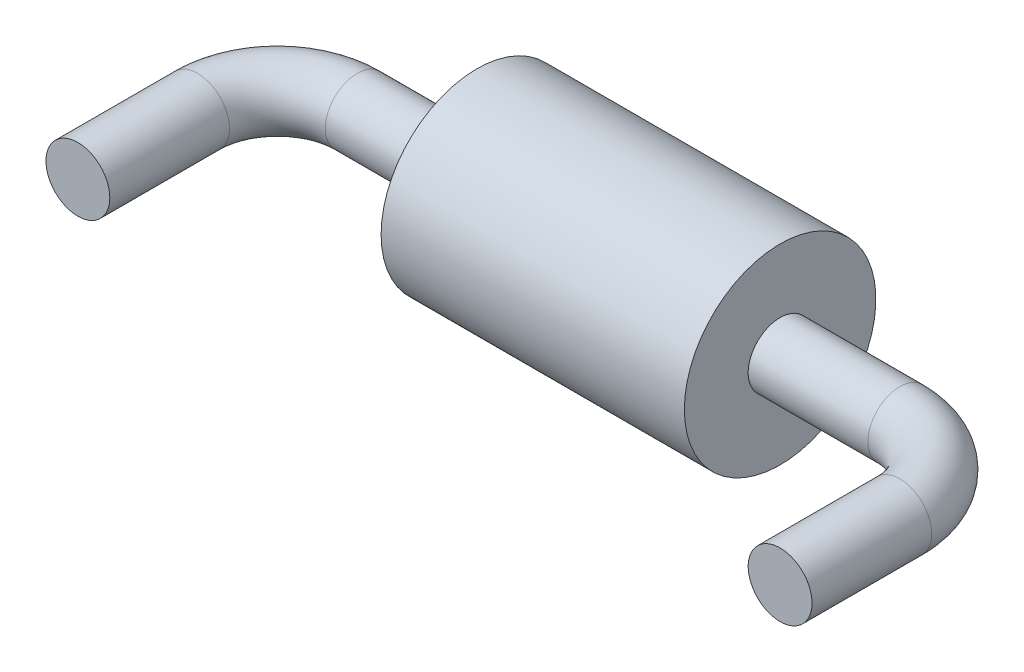
ISO-10303-21;
HEADER;
FILE_DESCRIPTION(('STEP AP214'),'2;1');
FILE_NAME('part.step','',(''),(''),'','','');
FILE_SCHEMA(('AUTOMOTIVE_DESIGN { 1 0 10303 214 1 1 1 1 }'));
ENDSEC;
DATA;
#1=APPLICATION_CONTEXT('core data for automotive mechanical design processes');
#2=APPLICATION_PROTOCOL_DEFINITION('international standard','automotive_design',2000,#1);
#3=PRODUCT_CONTEXT('',#1,'mechanical');
#4=PRODUCT('Part','Part','',(#3));
#5=PRODUCT_RELATED_PRODUCT_CATEGORY('part','',(#4));
#6=PRODUCT_DEFINITION_FORMATION('','',#4);
#7=PRODUCT_DEFINITION_CONTEXT('part definition',#1,'design');
#8=PRODUCT_DEFINITION('design','',#6,#7);
#9=PRODUCT_DEFINITION_SHAPE('','',#8);
#10=(LENGTH_UNIT() NAMED_UNIT(*) SI_UNIT(.MILLI.,.METRE.));
#11=(NAMED_UNIT(*) PLANE_ANGLE_UNIT() SI_UNIT($,.RADIAN.));
#12=(NAMED_UNIT(*) SI_UNIT($,.STERADIAN.) SOLID_ANGLE_UNIT());
#13=UNCERTAINTY_MEASURE_WITH_UNIT(LENGTH_MEASURE(1.E-05),#10,'distance_accuracy_value','');
#14=(GEOMETRIC_REPRESENTATION_CONTEXT(3) GLOBAL_UNCERTAINTY_ASSIGNED_CONTEXT((#13)) GLOBAL_UNIT_ASSIGNED_CONTEXT((#10,
#11,#12)) REPRESENTATION_CONTEXT('',''));
#15=CARTESIAN_POINT('',(0.,0.,0.));
#16=DIRECTION('',(0.,0.,1.));
#17=DIRECTION('',(1.,0.,0.));
#18=AXIS2_PLACEMENT_3D('',#15,#16,#17);
#19=CARTESIAN_POINT('',(3.8,0.,2.5));
#20=DIRECTION('',(0.,0.,1.));
#21=DIRECTION('',(1.,0.,0.));
#22=AXIS2_PLACEMENT_3D('',#19,#20,#21);
#23=PLANE('',#22);
#24=CARTESIAN_POINT('',(3.8,0.,2.5));
#25=DIRECTION('',(0.,0.,1.));
#26=DIRECTION('',(1.,0.,0.));
#27=AXIS2_PLACEMENT_3D('',#24,#25,#26);
#28=CIRCLE('',#27,0.4);
#29=CARTESIAN_POINT('',(4.2,0.,2.5));
#30=VERTEX_POINT('',#29);
#31=EDGE_CURVE('E18',#30,#30,#28,.F.);
#32=ORIENTED_EDGE('',*,*,#31,.F.);
#33=EDGE_LOOP('',(#32));
#34=FACE_BOUND('',#33,.T.);
#35=ADVANCED_FACE('F15',(#34),#23,.T.);
#36=CARTESIAN_POINT('',(-5.,0.,2.5));
#37=DIRECTION('',(0.,0.,1.));
#38=DIRECTION('',(1.,0.,0.));
#39=AXIS2_PLACEMENT_3D('',#36,#37,#38);
#40=PLANE('',#39);
#41=CARTESIAN_POINT('',(-5.,0.,2.5));
#42=DIRECTION('',(0.,0.,1.));
#43=DIRECTION('',(1.,0.,0.));
#44=AXIS2_PLACEMENT_3D('',#41,#42,#43);
#45=CIRCLE('',#44,0.4);
#46=CARTESIAN_POINT('',(-4.6,0.,2.5));
#47=VERTEX_POINT('',#46);
#48=EDGE_CURVE('E38',#47,#47,#45,.F.);
#49=ORIENTED_EDGE('',*,*,#48,.F.);
#50=EDGE_LOOP('',(#49));
#51=FACE_BOUND('',#50,.T.);
#52=ADVANCED_FACE('F51',(#51),#40,.T.);
#53=CARTESIAN_POINT('',(3.8,0.,1.));
#54=DIRECTION('',(0.,0.,1.));
#55=DIRECTION('',(1.,0.,0.));
#56=AXIS2_PLACEMENT_3D('',#53,#54,#55);
#57=CYLINDRICAL_SURFACE('',#56,0.4);
#58=ORIENTED_EDGE('',*,*,#31,.T.);
#59=EDGE_LOOP('',(#58));
#60=FACE_BOUND('',#59,.T.);
#61=CARTESIAN_POINT('',(3.8,0.,1.));
#62=DIRECTION('',(0.,0.,1.));
#63=DIRECTION('',(1.,0.,0.));
#64=AXIS2_PLACEMENT_3D('',#61,#62,#63);
#65=CIRCLE('',#64,0.4);
#66=CARTESIAN_POINT('',(4.2,0.,1.));
#67=VERTEX_POINT('',#66);
#68=EDGE_CURVE('E30',#67,#67,#65,.F.);
#69=ORIENTED_EDGE('',*,*,#68,.F.);
#70=EDGE_LOOP('',(#69));
#71=FACE_BOUND('',#70,.T.);
#72=ADVANCED_FACE('F47',(#60,#71),#57,.T.);
#73=CARTESIAN_POINT('',(-5.,0.,1.));
#74=DIRECTION('',(0.,0.,1.));
#75=DIRECTION('',(1.,0.,0.));
#76=AXIS2_PLACEMENT_3D('',#73,#74,#75);
#77=CYLINDRICAL_SURFACE('',#76,0.4);
#78=CARTESIAN_POINT('',(-5.,0.,1.));
#79=DIRECTION('',(0.,0.,1.));
#80=DIRECTION('',(-1.,0.,0.));
#81=AXIS2_PLACEMENT_3D('',#78,#79,#80);
#82=CIRCLE('',#81,0.4);
#83=CARTESIAN_POINT('',(-5.4,0.,1.));
#84=VERTEX_POINT('',#83);
#85=EDGE_CURVE('E43',#84,#84,#82,.F.);
#86=ORIENTED_EDGE('',*,*,#85,.F.);
#87=EDGE_LOOP('',(#86));
#88=FACE_BOUND('',#87,.T.);
#89=ORIENTED_EDGE('',*,*,#48,.T.);
#90=EDGE_LOOP('',(#89));
#91=FACE_BOUND('',#90,.T.);
#92=ADVANCED_FACE('F98',(#88,#91),#77,.T.);
#93=CARTESIAN_POINT('',(2.8,0.,1.));
#94=DIRECTION('',(0.,-1.,0.));
#95=DIRECTION('',(0.,0.,-1.));
#96=AXIS2_PLACEMENT_3D('',#93,#94,#95);
#97=TOROIDAL_SURFACE('',#96,1.,0.4);
#98=CARTESIAN_POINT('',(2.8,0.,0.));
#99=DIRECTION('',(1.,0.,0.));
#100=DIRECTION('',(0.,0.,-1.));
#101=AXIS2_PLACEMENT_3D('',#98,#99,#100);
#102=CIRCLE('',#101,0.4);
#103=CARTESIAN_POINT('',(2.8,0.,-0.4));
#104=VERTEX_POINT('',#103);
#105=EDGE_CURVE('E91',#104,#104,#102,.F.);
#106=ORIENTED_EDGE('',*,*,#105,.F.);
#107=EDGE_LOOP('',(#106));
#108=FACE_BOUND('',#107,.T.);
#109=ORIENTED_EDGE('',*,*,#68,.T.);
#110=EDGE_LOOP('',(#109));
#111=FACE_BOUND('',#110,.T.);
#112=ADVANCED_FACE('F84',(#108,#111),#97,.T.);
#113=CARTESIAN_POINT('',(-4.,0.,1.));
#114=DIRECTION('',(0.,1.,0.));
#115=DIRECTION('',(0.,0.,1.));
#116=AXIS2_PLACEMENT_3D('',#113,#114,#115);
#117=TOROIDAL_SURFACE('',#116,1.,0.4);
#118=CARTESIAN_POINT('',(-4.,0.,0.));
#119=DIRECTION('',(1.,0.,0.));
#120=DIRECTION('',(0.,0.,-1.));
#121=AXIS2_PLACEMENT_3D('',#118,#119,#120);
#122=CIRCLE('',#121,0.4);
#123=CARTESIAN_POINT('',(-4.,0.,-0.4));
#124=VERTEX_POINT('',#123);
#125=EDGE_CURVE('E37',#124,#124,#122,.T.);
#126=ORIENTED_EDGE('',*,*,#125,.F.);
#127=EDGE_LOOP('',(#126));
#128=FACE_BOUND('',#127,.T.);
#129=ORIENTED_EDGE('',*,*,#85,.T.);
#130=EDGE_LOOP('',(#129));
#131=FACE_BOUND('',#130,.T.);
#132=ADVANCED_FACE('F79',(#128,#131),#117,.T.);
#133=CARTESIAN_POINT('',(1.3,0.,0.));
#134=DIRECTION('',(1.,0.,0.));
#135=DIRECTION('',(0.,0.,-1.));
#136=AXIS2_PLACEMENT_3D('',#133,#134,#135);
#137=CYLINDRICAL_SURFACE('',#136,0.4);
#138=ORIENTED_EDGE('',*,*,#105,.T.);
#139=EDGE_LOOP('',(#138));
#140=FACE_BOUND('',#139,.T.);
#141=CARTESIAN_POINT('',(1.3,0.,0.));
#142=DIRECTION('',(1.,0.,0.));
#143=DIRECTION('',(0.,0.,-1.));
#144=AXIS2_PLACEMENT_3D('',#141,#142,#143);
#145=CIRCLE('',#144,0.4);
#146=CARTESIAN_POINT('',(1.3,0.,-0.4));
#147=VERTEX_POINT('',#146);
#148=EDGE_CURVE('E35',#147,#147,#145,.T.);
#149=ORIENTED_EDGE('',*,*,#148,.T.);
#150=EDGE_LOOP('',(#149));
#151=FACE_BOUND('',#150,.T.);
#152=ADVANCED_FACE('F75',(#140,#151),#137,.T.);
#153=CARTESIAN_POINT('',(-4.,0.,0.));
#154=DIRECTION('',(1.,0.,0.));
#155=DIRECTION('',(0.,0.,-1.));
#156=AXIS2_PLACEMENT_3D('',#153,#154,#155);
#157=CYLINDRICAL_SURFACE('',#156,0.4);
#158=ORIENTED_EDGE('',*,*,#125,.T.);
#159=EDGE_LOOP('',(#158));
#160=FACE_BOUND('',#159,.T.);
#161=CARTESIAN_POINT('',(-2.5,0.,0.));
#162=DIRECTION('',(1.,0.,0.));
#163=DIRECTION('',(0.,0.,-1.));
#164=AXIS2_PLACEMENT_3D('',#161,#162,#163);
#165=CIRCLE('',#164,0.4);
#166=CARTESIAN_POINT('',(-2.5,0.,-0.4));
#167=VERTEX_POINT('',#166);
#168=EDGE_CURVE('E27',#167,#167,#165,.F.);
#169=ORIENTED_EDGE('',*,*,#168,.T.);
#170=EDGE_LOOP('',(#169));
#171=FACE_BOUND('',#170,.T.);
#172=ADVANCED_FACE('F71',(#160,#171),#157,.T.);
#173=CARTESIAN_POINT('',(1.3,1.2,0.));
#174=DIRECTION('',(-1.,0.,0.));
#175=DIRECTION('',(0.,0.,1.));
#176=AXIS2_PLACEMENT_3D('',#173,#174,#175);
#177=PLANE('',#176);
#178=CARTESIAN_POINT('',(1.3,0.,0.));
#179=DIRECTION('',(-1.,0.,0.));
#180=DIRECTION('',(0.,0.,1.));
#181=AXIS2_PLACEMENT_3D('',#178,#179,#180);
#182=CIRCLE('',#181,1.2);
#183=CARTESIAN_POINT('',(1.3,0.,1.2));
#184=VERTEX_POINT('',#183);
#185=EDGE_CURVE('E22',#184,#184,#182,.T.);
#186=ORIENTED_EDGE('',*,*,#185,.F.);
#187=EDGE_LOOP('',(#186));
#188=FACE_BOUND('',#187,.T.);
#189=ORIENTED_EDGE('',*,*,#148,.F.);
#190=EDGE_LOOP('',(#189));
#191=FACE_BOUND('',#190,.T.);
#192=ADVANCED_FACE('F64',(#188,#191),#177,.F.);
#193=CARTESIAN_POINT('',(-2.5,1.2,0.));
#194=DIRECTION('',(1.,0.,0.));
#195=DIRECTION('',(0.,0.,-1.));
#196=AXIS2_PLACEMENT_3D('',#193,#194,#195);
#197=PLANE('',#196);
#198=ORIENTED_EDGE('',*,*,#168,.F.);
#199=EDGE_LOOP('',(#198));
#200=FACE_BOUND('',#199,.T.);
#201=CARTESIAN_POINT('',(-2.5,0.,0.));
#202=DIRECTION('',(-1.,0.,0.));
#203=DIRECTION('',(0.,0.,1.));
#204=AXIS2_PLACEMENT_3D('',#201,#202,#203);
#205=CIRCLE('',#204,1.2);
#206=CARTESIAN_POINT('',(-2.5,0.,1.2));
#207=VERTEX_POINT('',#206);
#208=EDGE_CURVE('E10',#207,#207,#205,.F.);
#209=ORIENTED_EDGE('',*,*,#208,.F.);
#210=EDGE_LOOP('',(#209));
#211=FACE_BOUND('',#210,.T.);
#212=ADVANCED_FACE('F59',(#200,#211),#197,.F.);
#213=CARTESIAN_POINT('',(-2.5,0.,0.));
#214=DIRECTION('',(-1.,0.,0.));
#215=DIRECTION('',(0.,0.,1.));
#216=AXIS2_PLACEMENT_3D('',#213,#214,#215);
#217=CYLINDRICAL_SURFACE('',#216,1.2);
#218=ORIENTED_EDGE('',*,*,#208,.T.);
#219=EDGE_LOOP('',(#218));
#220=FACE_BOUND('',#219,.T.);
#221=ORIENTED_EDGE('',*,*,#185,.T.);
#222=EDGE_LOOP('',(#221));
#223=FACE_BOUND('',#222,.T.);
#224=ADVANCED_FACE('F57',(#220,#223),#217,.T.);
#225=CLOSED_SHELL('',(#35,#52,#72,#92,#112,#132,#152,#172,#192,#212,#224));
#226=MANIFOLD_SOLID_BREP('B1',#225);
#227=ADVANCED_BREP_SHAPE_REPRESENTATION('',(#18,#226),#14);
#228=SHAPE_DEFINITION_REPRESENTATION(#9,#227);
ENDSEC;
END-ISO-10303-21;
